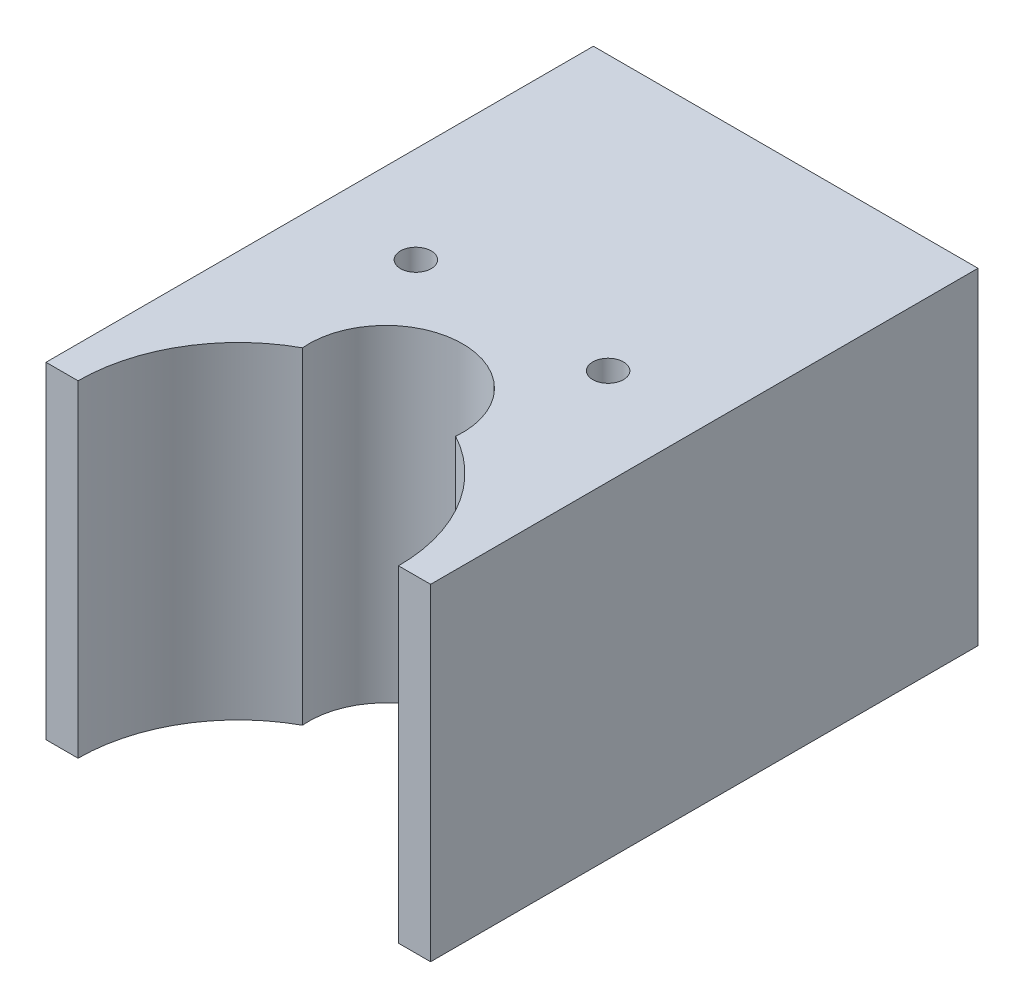
ISO-10303-21;
HEADER;
FILE_DESCRIPTION(('STEP AP214'),'2;1');
FILE_NAME('part.step','',(''),(''),'','','');
FILE_SCHEMA(('AUTOMOTIVE_DESIGN { 1 0 10303 214 1 1 1 1 }'));
ENDSEC;
DATA;
#1=APPLICATION_CONTEXT('core data for automotive mechanical design processes');
#2=APPLICATION_PROTOCOL_DEFINITION('international standard','automotive_design',2000,#1);
#3=PRODUCT_CONTEXT('',#1,'mechanical');
#4=PRODUCT('Part','Part','',(#3));
#5=PRODUCT_RELATED_PRODUCT_CATEGORY('part','',(#4));
#6=PRODUCT_DEFINITION_FORMATION('','',#4);
#7=PRODUCT_DEFINITION_CONTEXT('part definition',#1,'design');
#8=PRODUCT_DEFINITION('design','',#6,#7);
#9=PRODUCT_DEFINITION_SHAPE('','',#8);
#10=(LENGTH_UNIT() NAMED_UNIT(*) SI_UNIT(.MILLI.,.METRE.));
#11=(NAMED_UNIT(*) PLANE_ANGLE_UNIT() SI_UNIT($,.RADIAN.));
#12=(NAMED_UNIT(*) SI_UNIT($,.STERADIAN.) SOLID_ANGLE_UNIT());
#13=UNCERTAINTY_MEASURE_WITH_UNIT(LENGTH_MEASURE(1.E-05),#10,'distance_accuracy_value','');
#14=(GEOMETRIC_REPRESENTATION_CONTEXT(3) GLOBAL_UNCERTAINTY_ASSIGNED_CONTEXT((#13)) GLOBAL_UNIT_ASSIGNED_CONTEXT((#10,
#11,#12)) REPRESENTATION_CONTEXT('',''));
#15=CARTESIAN_POINT('',(0.,0.,0.));
#16=DIRECTION('',(0.,0.,1.));
#17=DIRECTION('',(1.,0.,0.));
#18=AXIS2_PLACEMENT_3D('',#15,#16,#17);
#19=CARTESIAN_POINT('',(0.,12.75,0.));
#20=DIRECTION('',(1.,0.,0.));
#21=DIRECTION('',(0.,0.,-1.));
#22=AXIS2_PLACEMENT_3D('',#19,#20,#21);
#23=PLANE('',#22);
#24=DIRECTION('',(0.,1.,0.));
#25=VECTOR('',#24,1.);
#26=CARTESIAN_POINT('',(0.,0.,21.35));
#27=LINE('',#26,#25);
#28=CARTESIAN_POINT('',(0.,0.,21.35));
#29=VERTEX_POINT('',#28);
#30=CARTESIAN_POINT('',(0.,12.75,21.35));
#31=VERTEX_POINT('',#30);
#32=EDGE_CURVE('E108',#29,#31,#27,.T.);
#33=ORIENTED_EDGE('',*,*,#32,.T.);
#34=DIRECTION('',(0.,0.,1.));
#35=VECTOR('',#34,1.);
#36=CARTESIAN_POINT('',(0.,12.75,0.));
#37=LINE('',#36,#35);
#38=CARTESIAN_POINT('',(0.,12.75,0.));
#39=VERTEX_POINT('',#38);
#40=EDGE_CURVE('E144',#39,#31,#37,.T.);
#41=ORIENTED_EDGE('',*,*,#40,.F.);
#42=DIRECTION('',(0.,-1.,0.));
#43=VECTOR('',#42,1.);
#44=CARTESIAN_POINT('',(0.,12.75,0.));
#45=LINE('',#44,#43);
#46=CARTESIAN_POINT('',(0.,0.,0.));
#47=VERTEX_POINT('',#46);
#48=EDGE_CURVE('E131',#39,#47,#45,.T.);
#49=ORIENTED_EDGE('',*,*,#48,.T.);
#50=DIRECTION('',(0.,0.,1.));
#51=VECTOR('',#50,1.);
#52=CARTESIAN_POINT('',(0.,0.,0.));
#53=LINE('',#52,#51);
#54=EDGE_CURVE('E124',#47,#29,#53,.T.);
#55=ORIENTED_EDGE('',*,*,#54,.T.);
#56=EDGE_LOOP('',(#33,#41,#49,#55));
#57=FACE_BOUND('',#56,.T.);
#58=ADVANCED_FACE('F46',(#57),#23,.F.);
#59=CARTESIAN_POINT('',(15.,12.75,0.));
#60=DIRECTION('',(1.,0.,0.));
#61=DIRECTION('',(0.,0.,-1.));
#62=AXIS2_PLACEMENT_3D('',#59,#60,#61);
#63=PLANE('',#62);
#64=DIRECTION('',(0.,0.,1.));
#65=VECTOR('',#64,1.);
#66=CARTESIAN_POINT('',(15.,12.75,0.));
#67=LINE('',#66,#65);
#68=CARTESIAN_POINT('',(15.,12.75,0.));
#69=VERTEX_POINT('',#68);
#70=CARTESIAN_POINT('',(15.,12.75,21.35));
#71=VERTEX_POINT('',#70);
#72=EDGE_CURVE('E136',#69,#71,#67,.T.);
#73=ORIENTED_EDGE('',*,*,#72,.T.);
#74=DIRECTION('',(0.,1.,0.));
#75=VECTOR('',#74,1.);
#76=CARTESIAN_POINT('',(15.,0.,21.35));
#77=LINE('',#76,#75);
#78=CARTESIAN_POINT('',(15.,0.,21.35));
#79=VERTEX_POINT('',#78);
#80=EDGE_CURVE('E116',#79,#71,#77,.T.);
#81=ORIENTED_EDGE('',*,*,#80,.F.);
#82=DIRECTION('',(0.,0.,1.));
#83=VECTOR('',#82,1.);
#84=CARTESIAN_POINT('',(15.,0.,0.));
#85=LINE('',#84,#83);
#86=CARTESIAN_POINT('',(15.,0.,0.));
#87=VERTEX_POINT('',#86);
#88=EDGE_CURVE('E133',#87,#79,#85,.T.);
#89=ORIENTED_EDGE('',*,*,#88,.F.);
#90=DIRECTION('',(0.,-1.,0.));
#91=VECTOR('',#90,1.);
#92=CARTESIAN_POINT('',(15.,12.75,0.));
#93=LINE('',#92,#91);
#94=EDGE_CURVE('E143',#69,#87,#93,.T.);
#95=ORIENTED_EDGE('',*,*,#94,.F.);
#96=EDGE_LOOP('',(#73,#81,#89,#95));
#97=FACE_BOUND('',#96,.T.);
#98=ADVANCED_FACE('F179',(#97),#63,.T.);
#99=CARTESIAN_POINT('',(0.,12.75,0.));
#100=DIRECTION('',(0.,-1.,0.));
#101=DIRECTION('',(0.,0.,-1.));
#102=AXIS2_PLACEMENT_3D('',#99,#100,#101);
#103=PLANE('',#102);
#104=CARTESIAN_POINT('',(11.25,12.75,10.675));
#105=DIRECTION('',(0.,1.,0.));
#106=DIRECTION('',(0.,0.,1.));
#107=AXIS2_PLACEMENT_3D('',#104,#105,#106);
#108=CIRCLE('',#107,0.6);
#109=CARTESIAN_POINT('',(11.25,12.75,11.275));
#110=VERTEX_POINT('',#109);
#111=EDGE_CURVE('E209',#110,#110,#108,.T.);
#112=ORIENTED_EDGE('',*,*,#111,.F.);
#113=EDGE_LOOP('',(#112));
#114=FACE_BOUND('',#113,.T.);
#115=CARTESIAN_POINT('',(3.74999999999995,12.75,10.675));
#116=DIRECTION('',(0.,1.,0.));
#117=DIRECTION('',(0.,0.,1.));
#118=AXIS2_PLACEMENT_3D('',#115,#116,#117);
#119=CIRCLE('',#118,0.6);
#120=CARTESIAN_POINT('',(3.74999999999995,12.75,11.275));
#121=VERTEX_POINT('',#120);
#122=EDGE_CURVE('E214',#121,#121,#119,.T.);
#123=ORIENTED_EDGE('',*,*,#122,.F.);
#124=EDGE_LOOP('',(#123));
#125=FACE_BOUND('',#124,.T.);
#126=DIRECTION('',(1.,0.,0.));
#127=VECTOR('',#126,1.);
#128=CARTESIAN_POINT('',(15.,12.75,21.35));
#129=LINE('',#128,#127);
#130=CARTESIAN_POINT('',(13.75,12.75,21.35));
#131=VERTEX_POINT('',#130);
#132=EDGE_CURVE('E68',#131,#71,#129,.T.);
#133=ORIENTED_EDGE('',*,*,#132,.T.);
#134=ORIENTED_EDGE('',*,*,#72,.F.);
#135=DIRECTION('',(1.,0.,0.));
#136=VECTOR('',#135,1.);
#137=CARTESIAN_POINT('',(0.,12.75,0.));
#138=LINE('',#137,#136);
#139=EDGE_CURVE('E132',#39,#69,#138,.T.);
#140=ORIENTED_EDGE('',*,*,#139,.F.);
#141=ORIENTED_EDGE('',*,*,#40,.T.);
#142=CARTESIAN_POINT('',(1.25,12.75,21.35));
#143=VERTEX_POINT('',#142);
#144=EDGE_CURVE('E111',#31,#143,#129,.T.);
#145=ORIENTED_EDGE('',*,*,#144,.T.);
#146=CARTESIAN_POINT('',(7.5,12.75,21.35));
#147=DIRECTION('',(0.,1.,0.));
#148=DIRECTION('',(0.,0.,1.));
#149=AXIS2_PLACEMENT_3D('',#146,#147,#148);
#150=CIRCLE('',#149,6.25);
#151=CARTESIAN_POINT('',(4.5113636772027,12.75,15.8608695652174));
#152=VERTEX_POINT('',#151);
#153=EDGE_CURVE('E161',#152,#143,#150,.T.);
#154=ORIENTED_EDGE('',*,*,#153,.F.);
#155=CARTESIAN_POINT('',(7.49999999999999,12.75,15.6));
#156=DIRECTION('',(0.,1.,0.));
#157=DIRECTION('',(0.,0.,1.));
#158=AXIS2_PLACEMENT_3D('',#155,#156,#157);
#159=CIRCLE('',#158,3.);
#160=CARTESIAN_POINT('',(10.4886363227973,12.75,15.8608695652174));
#161=VERTEX_POINT('',#160);
#162=EDGE_CURVE('E160',#161,#152,#159,.T.);
#163=ORIENTED_EDGE('',*,*,#162,.F.);
#164=EDGE_CURVE('E150',#131,#161,#150,.T.);
#165=ORIENTED_EDGE('',*,*,#164,.F.);
#166=EDGE_LOOP('',(#133,#134,#140,#141,#145,#154,#163,#165));
#167=FACE_BOUND('',#166,.T.);
#168=ADVANCED_FACE('F156',(#114,#125,#167),#103,.F.);
#169=CARTESIAN_POINT('',(0.,0.,0.));
#170=DIRECTION('',(0.,-1.,0.));
#171=DIRECTION('',(0.,0.,-1.));
#172=AXIS2_PLACEMENT_3D('',#169,#170,#171);
#173=PLANE('',#172);
#174=CARTESIAN_POINT('',(3.49999999999996,0.,11.35));
#175=DIRECTION('',(0.,-1.,0.));
#176=DIRECTION('',(0.,0.,-1.));
#177=AXIS2_PLACEMENT_3D('',#174,#175,#176);
#178=CIRCLE('',#177,0.6);
#179=CARTESIAN_POINT('',(3.49999999999996,0.,10.75));
#180=VERTEX_POINT('',#179);
#181=EDGE_CURVE('E190',#180,#180,#178,.T.);
#182=ORIENTED_EDGE('',*,*,#181,.F.);
#183=EDGE_LOOP('',(#182));
#184=FACE_BOUND('',#183,.T.);
#185=CARTESIAN_POINT('',(11.5,0.,11.35));
#186=DIRECTION('',(0.,-1.,0.));
#187=DIRECTION('',(0.,0.,-1.));
#188=AXIS2_PLACEMENT_3D('',#185,#186,#187);
#189=CIRCLE('',#188,0.6);
#190=CARTESIAN_POINT('',(11.5,0.,10.75));
#191=VERTEX_POINT('',#190);
#192=EDGE_CURVE('E195',#191,#191,#189,.T.);
#193=ORIENTED_EDGE('',*,*,#192,.F.);
#194=EDGE_LOOP('',(#193));
#195=FACE_BOUND('',#194,.T.);
#196=ORIENTED_EDGE('',*,*,#88,.T.);
#197=DIRECTION('',(1.,0.,0.));
#198=VECTOR('',#197,1.);
#199=CARTESIAN_POINT('',(15.,0.,21.35));
#200=LINE('',#199,#198);
#201=CARTESIAN_POINT('',(13.75,0.,21.35));
#202=VERTEX_POINT('',#201);
#203=EDGE_CURVE('E129',#202,#79,#200,.T.);
#204=ORIENTED_EDGE('',*,*,#203,.F.);
#205=CARTESIAN_POINT('',(7.5,0.,21.35));
#206=DIRECTION('',(0.,1.,0.));
#207=DIRECTION('',(0.,0.,1.));
#208=AXIS2_PLACEMENT_3D('',#205,#206,#207);
#209=CIRCLE('',#208,6.25);
#210=CARTESIAN_POINT('',(10.4886363227973,0.,15.8608695652174));
#211=VERTEX_POINT('',#210);
#212=EDGE_CURVE('E152',#202,#211,#209,.T.);
#213=ORIENTED_EDGE('',*,*,#212,.T.);
#214=CARTESIAN_POINT('',(7.49999999999999,0.,15.6));
#215=DIRECTION('',(0.,1.,0.));
#216=DIRECTION('',(0.,0.,1.));
#217=AXIS2_PLACEMENT_3D('',#214,#215,#216);
#218=CIRCLE('',#217,3.);
#219=CARTESIAN_POINT('',(4.5113636772027,0.,15.8608695652174));
#220=VERTEX_POINT('',#219);
#221=EDGE_CURVE('E164',#211,#220,#218,.T.);
#222=ORIENTED_EDGE('',*,*,#221,.T.);
#223=CARTESIAN_POINT('',(1.25,0.,21.35));
#224=VERTEX_POINT('',#223);
#225=EDGE_CURVE('E128',#220,#224,#209,.T.);
#226=ORIENTED_EDGE('',*,*,#225,.T.);
#227=EDGE_CURVE('E61',#29,#224,#200,.T.);
#228=ORIENTED_EDGE('',*,*,#227,.F.);
#229=ORIENTED_EDGE('',*,*,#54,.F.);
#230=DIRECTION('',(1.,0.,0.));
#231=VECTOR('',#230,1.);
#232=CARTESIAN_POINT('',(0.,0.,0.));
#233=LINE('',#232,#231);
#234=EDGE_CURVE('E138',#47,#87,#233,.T.);
#235=ORIENTED_EDGE('',*,*,#234,.T.);
#236=EDGE_LOOP('',(#196,#204,#213,#222,#226,#228,#229,#235));
#237=FACE_BOUND('',#236,.T.);
#238=ADVANCED_FACE('F122',(#184,#195,#237),#173,.T.);
#239=CARTESIAN_POINT('',(7.5,12.75,21.35));
#240=DIRECTION('',(0.,-1.,0.));
#241=DIRECTION('',(0.,0.,-1.));
#242=AXIS2_PLACEMENT_3D('',#239,#240,#241);
#243=CYLINDRICAL_SURFACE('',#242,6.25);
#244=ORIENTED_EDGE('',*,*,#153,.T.);
#245=DIRECTION('',(0.,-1.,0.));
#246=VECTOR('',#245,1.);
#247=CARTESIAN_POINT('',(1.25,12.75,21.35));
#248=LINE('',#247,#246);
#249=EDGE_CURVE('E13',#143,#224,#248,.T.);
#250=ORIENTED_EDGE('',*,*,#249,.T.);
#251=ORIENTED_EDGE('',*,*,#225,.F.);
#252=DIRECTION('',(0.,-1.,0.));
#253=VECTOR('',#252,1.);
#254=CARTESIAN_POINT('',(4.5113636772027,6.375,15.8608695652174));
#255=LINE('',#254,#253);
#256=EDGE_CURVE('E171',#152,#220,#255,.T.);
#257=ORIENTED_EDGE('',*,*,#256,.F.);
#258=EDGE_LOOP('',(#244,#250,#251,#257));
#259=FACE_BOUND('',#258,.T.);
#260=ADVANCED_FACE('F187',(#259),#243,.F.);
#261=ORIENTED_EDGE('',*,*,#212,.F.);
#262=DIRECTION('',(0.,-1.,0.));
#263=VECTOR('',#262,1.);
#264=CARTESIAN_POINT('',(13.75,12.75,21.35));
#265=LINE('',#264,#263);
#266=EDGE_CURVE('E54',#202,#131,#265,.F.);
#267=ORIENTED_EDGE('',*,*,#266,.T.);
#268=ORIENTED_EDGE('',*,*,#164,.T.);
#269=DIRECTION('',(0.,-1.,0.));
#270=VECTOR('',#269,1.);
#271=CARTESIAN_POINT('',(10.4886363227973,6.375,15.8608695652174));
#272=LINE('',#271,#270);
#273=EDGE_CURVE('E169',#211,#161,#272,.F.);
#274=ORIENTED_EDGE('',*,*,#273,.F.);
#275=EDGE_LOOP('',(#261,#267,#268,#274));
#276=FACE_BOUND('',#275,.T.);
#277=ADVANCED_FACE('F148',(#276),#243,.F.);
#278=CARTESIAN_POINT('',(0.,12.75,0.));
#279=DIRECTION('',(0.,0.,-1.));
#280=DIRECTION('',(-1.,0.,0.));
#281=AXIS2_PLACEMENT_3D('',#278,#279,#280);
#282=PLANE('',#281);
#283=ORIENTED_EDGE('',*,*,#234,.F.);
#284=ORIENTED_EDGE('',*,*,#48,.F.);
#285=ORIENTED_EDGE('',*,*,#139,.T.);
#286=ORIENTED_EDGE('',*,*,#94,.T.);
#287=EDGE_LOOP('',(#283,#284,#285,#286));
#288=FACE_BOUND('',#287,.T.);
#289=ADVANCED_FACE('F48',(#288),#282,.T.);
#290=CARTESIAN_POINT('',(7.49999999999999,12.75,15.6));
#291=DIRECTION('',(0.,-1.,0.));
#292=DIRECTION('',(0.,0.,-1.));
#293=AXIS2_PLACEMENT_3D('',#290,#291,#292);
#294=CYLINDRICAL_SURFACE('',#293,3.);
#295=ORIENTED_EDGE('',*,*,#256,.T.);
#296=ORIENTED_EDGE('',*,*,#221,.F.);
#297=ORIENTED_EDGE('',*,*,#273,.T.);
#298=ORIENTED_EDGE('',*,*,#162,.T.);
#299=EDGE_LOOP('',(#295,#296,#297,#298));
#300=FACE_BOUND('',#299,.T.);
#301=ADVANCED_FACE('F185',(#300),#294,.F.);
#302=CARTESIAN_POINT('',(15.,0.,21.35));
#303=DIRECTION('',(0.,0.,1.));
#304=DIRECTION('',(1.,0.,0.));
#305=AXIS2_PLACEMENT_3D('',#302,#303,#304);
#306=PLANE('',#305);
#307=ORIENTED_EDGE('',*,*,#203,.T.);
#308=ORIENTED_EDGE('',*,*,#80,.T.);
#309=ORIENTED_EDGE('',*,*,#132,.F.);
#310=ORIENTED_EDGE('',*,*,#266,.F.);
#311=EDGE_LOOP('',(#307,#308,#309,#310));
#312=FACE_BOUND('',#311,.T.);
#313=ADVANCED_FACE('F254',(#312),#306,.T.);
#314=ORIENTED_EDGE('',*,*,#144,.F.);
#315=ORIENTED_EDGE('',*,*,#32,.F.);
#316=ORIENTED_EDGE('',*,*,#227,.T.);
#317=ORIENTED_EDGE('',*,*,#249,.F.);
#318=EDGE_LOOP('',(#314,#315,#316,#317));
#319=FACE_BOUND('',#318,.T.);
#320=ADVANCED_FACE('F109',(#319),#306,.T.);
#321=CARTESIAN_POINT('',(11.5,3.,11.35));
#322=DIRECTION('',(0.,-1.,0.));
#323=DIRECTION('',(0.,0.,-1.));
#324=AXIS2_PLACEMENT_3D('',#321,#322,#323);
#325=CYLINDRICAL_SURFACE('',#324,0.6);
#326=CARTESIAN_POINT('',(11.5,3.,11.35));
#327=DIRECTION('',(0.,-1.,0.));
#328=DIRECTION('',(0.,0.,-1.));
#329=AXIS2_PLACEMENT_3D('',#326,#327,#328);
#330=CIRCLE('',#329,0.6);
#331=CARTESIAN_POINT('',(11.5,3.,10.75));
#332=VERTEX_POINT('',#331);
#333=EDGE_CURVE('E203',#332,#332,#330,.T.);
#334=ORIENTED_EDGE('',*,*,#333,.F.);
#335=EDGE_LOOP('',(#334));
#336=FACE_BOUND('',#335,.T.);
#337=ORIENTED_EDGE('',*,*,#192,.T.);
#338=EDGE_LOOP('',(#337));
#339=FACE_BOUND('',#338,.T.);
#340=ADVANCED_FACE('F260',(#336,#339),#325,.F.);
#341=CARTESIAN_POINT('',(11.5,3.,11.35));
#342=DIRECTION('',(0.,-1.,0.));
#343=DIRECTION('',(0.,0.,-1.));
#344=AXIS2_PLACEMENT_3D('',#341,#342,#343);
#345=PLANE('',#344);
#346=ORIENTED_EDGE('',*,*,#333,.T.);
#347=EDGE_LOOP('',(#346));
#348=FACE_BOUND('',#347,.T.);
#349=ADVANCED_FACE('F257',(#348),#345,.T.);
#350=CARTESIAN_POINT('',(3.49999999999996,3.,11.35));
#351=DIRECTION('',(0.,-1.,0.));
#352=DIRECTION('',(0.,0.,-1.));
#353=AXIS2_PLACEMENT_3D('',#350,#351,#352);
#354=CYLINDRICAL_SURFACE('',#353,0.6);
#355=CARTESIAN_POINT('',(3.49999999999996,3.,11.35));
#356=DIRECTION('',(0.,-1.,0.));
#357=DIRECTION('',(0.,0.,-1.));
#358=AXIS2_PLACEMENT_3D('',#355,#356,#357);
#359=CIRCLE('',#358,0.6);
#360=CARTESIAN_POINT('',(3.49999999999996,3.,10.75));
#361=VERTEX_POINT('',#360);
#362=EDGE_CURVE('E188',#361,#361,#359,.T.);
#363=ORIENTED_EDGE('',*,*,#362,.F.);
#364=EDGE_LOOP('',(#363));
#365=FACE_BOUND('',#364,.T.);
#366=ORIENTED_EDGE('',*,*,#181,.T.);
#367=EDGE_LOOP('',(#366));
#368=FACE_BOUND('',#367,.T.);
#369=ADVANCED_FACE('F234',(#365,#368),#354,.F.);
#370=CARTESIAN_POINT('',(3.49999999999996,3.,11.35));
#371=DIRECTION('',(0.,-1.,0.));
#372=DIRECTION('',(0.,0.,-1.));
#373=AXIS2_PLACEMENT_3D('',#370,#371,#372);
#374=PLANE('',#373);
#375=ORIENTED_EDGE('',*,*,#362,.T.);
#376=EDGE_LOOP('',(#375));
#377=FACE_BOUND('',#376,.T.);
#378=ADVANCED_FACE('F226',(#377),#374,.T.);
#379=CARTESIAN_POINT('',(3.74999999999995,9.75,10.675));
#380=DIRECTION('',(0.,1.,0.));
#381=DIRECTION('',(0.,0.,1.));
#382=AXIS2_PLACEMENT_3D('',#379,#380,#381);
#383=CYLINDRICAL_SURFACE('',#382,0.6);
#384=CARTESIAN_POINT('',(3.74999999999995,9.75,10.675));
#385=DIRECTION('',(0.,1.,0.));
#386=DIRECTION('',(0.,0.,1.));
#387=AXIS2_PLACEMENT_3D('',#384,#385,#386);
#388=CIRCLE('',#387,0.6);
#389=CARTESIAN_POINT('',(3.74999999999995,9.75,11.275));
#390=VERTEX_POINT('',#389);
#391=EDGE_CURVE('E198',#390,#390,#388,.T.);
#392=ORIENTED_EDGE('',*,*,#391,.F.);
#393=EDGE_LOOP('',(#392));
#394=FACE_BOUND('',#393,.T.);
#395=ORIENTED_EDGE('',*,*,#122,.T.);
#396=EDGE_LOOP('',(#395));
#397=FACE_BOUND('',#396,.T.);
#398=ADVANCED_FACE('F224',(#394,#397),#383,.F.);
#399=CARTESIAN_POINT('',(3.74999999999995,9.75,10.675));
#400=DIRECTION('',(0.,1.,0.));
#401=DIRECTION('',(0.,0.,1.));
#402=AXIS2_PLACEMENT_3D('',#399,#400,#401);
#403=PLANE('',#402);
#404=ORIENTED_EDGE('',*,*,#391,.T.);
#405=EDGE_LOOP('',(#404));
#406=FACE_BOUND('',#405,.T.);
#407=ADVANCED_FACE('F222',(#406),#403,.T.);
#408=CARTESIAN_POINT('',(11.25,9.75,10.675));
#409=DIRECTION('',(0.,1.,0.));
#410=DIRECTION('',(0.,0.,1.));
#411=AXIS2_PLACEMENT_3D('',#408,#409,#410);
#412=CYLINDRICAL_SURFACE('',#411,0.6);
#413=CARTESIAN_POINT('',(11.25,9.75,10.675));
#414=DIRECTION('',(0.,1.,0.));
#415=DIRECTION('',(0.,0.,1.));
#416=AXIS2_PLACEMENT_3D('',#413,#414,#415);
#417=CIRCLE('',#416,0.6);
#418=CARTESIAN_POINT('',(11.25,9.75,11.275));
#419=VERTEX_POINT('',#418);
#420=EDGE_CURVE('E205',#419,#419,#417,.T.);
#421=ORIENTED_EDGE('',*,*,#420,.F.);
#422=EDGE_LOOP('',(#421));
#423=FACE_BOUND('',#422,.T.);
#424=ORIENTED_EDGE('',*,*,#111,.T.);
#425=EDGE_LOOP('',(#424));
#426=FACE_BOUND('',#425,.T.);
#427=ADVANCED_FACE('F232',(#423,#426),#412,.F.);
#428=CARTESIAN_POINT('',(11.25,9.75,10.675));
#429=DIRECTION('',(0.,1.,0.));
#430=DIRECTION('',(0.,0.,1.));
#431=AXIS2_PLACEMENT_3D('',#428,#429,#430);
#432=PLANE('',#431);
#433=ORIENTED_EDGE('',*,*,#420,.T.);
#434=EDGE_LOOP('',(#433));
#435=FACE_BOUND('',#434,.T.);
#436=ADVANCED_FACE('F307',(#435),#432,.T.);
#437=CLOSED_SHELL('',(#58,#98,#168,#238,#260,#277,#289,#301,#313,#320,#340,#349,#369,#378,#398,
#407,#427,#436));
#438=MANIFOLD_SOLID_BREP('B2',#437);
#439=ADVANCED_BREP_SHAPE_REPRESENTATION('',(#18,#438),#14);
#440=SHAPE_DEFINITION_REPRESENTATION(#9,#439);
ENDSEC;
END-ISO-10303-21;
